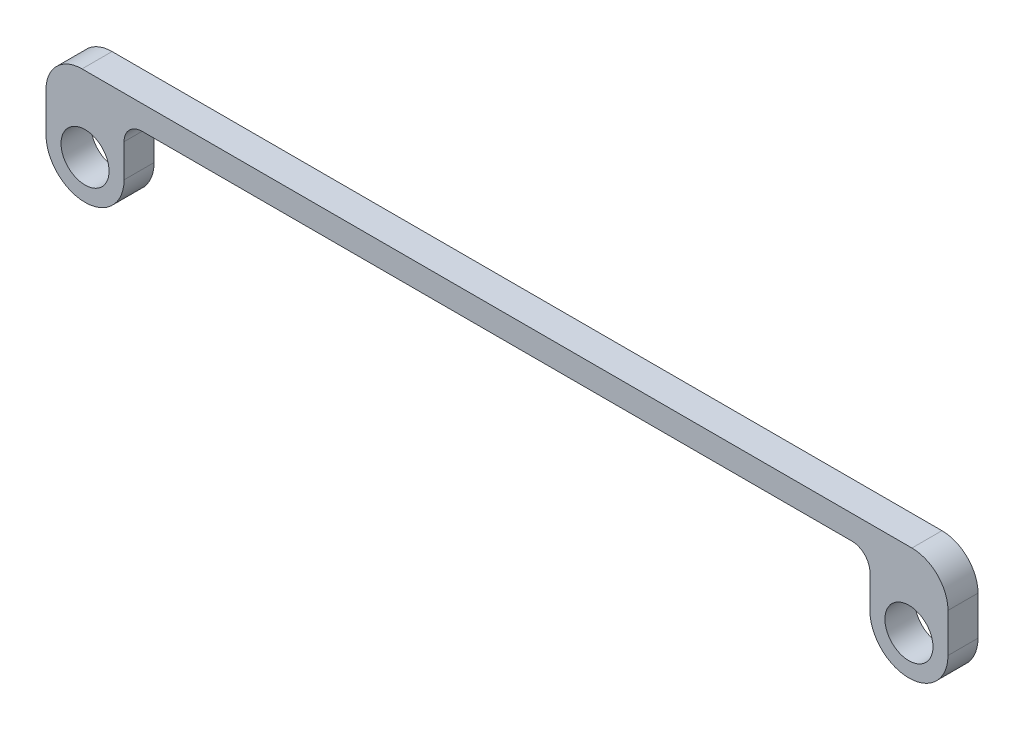
ISO-10303-21;
HEADER;
FILE_DESCRIPTION(('STEP AP214'),'2;1');
FILE_NAME('part.step','',(''),(''),'','','');
FILE_SCHEMA(('AUTOMOTIVE_DESIGN { 1 0 10303 214 1 1 1 1 }'));
ENDSEC;
DATA;
#1=APPLICATION_CONTEXT('core data for automotive mechanical design processes');
#2=APPLICATION_PROTOCOL_DEFINITION('international standard','automotive_design',2000,#1);
#3=PRODUCT_CONTEXT('',#1,'mechanical');
#4=PRODUCT('Part','Part','',(#3));
#5=PRODUCT_RELATED_PRODUCT_CATEGORY('part','',(#4));
#6=PRODUCT_DEFINITION_FORMATION('','',#4);
#7=PRODUCT_DEFINITION_CONTEXT('part definition',#1,'design');
#8=PRODUCT_DEFINITION('design','',#6,#7);
#9=PRODUCT_DEFINITION_SHAPE('','',#8);
#10=(LENGTH_UNIT() NAMED_UNIT(*) SI_UNIT(.MILLI.,.METRE.));
#11=(NAMED_UNIT(*) PLANE_ANGLE_UNIT() SI_UNIT($,.RADIAN.));
#12=(NAMED_UNIT(*) SI_UNIT($,.STERADIAN.) SOLID_ANGLE_UNIT());
#13=UNCERTAINTY_MEASURE_WITH_UNIT(LENGTH_MEASURE(1.E-05),#10,'distance_accuracy_value','');
#14=(GEOMETRIC_REPRESENTATION_CONTEXT(3) GLOBAL_UNCERTAINTY_ASSIGNED_CONTEXT((#13)) GLOBAL_UNIT_ASSIGNED_CONTEXT((#10,
#11,#12)) REPRESENTATION_CONTEXT('',''));
#15=CARTESIAN_POINT('',(0.,0.,0.));
#16=DIRECTION('',(0.,0.,1.));
#17=DIRECTION('',(1.,0.,0.));
#18=AXIS2_PLACEMENT_3D('',#15,#16,#17);
#19=CARTESIAN_POINT('',(0.,-4.,5.));
#20=DIRECTION('',(1.,0.,0.));
#21=DIRECTION('',(0.,0.,-1.));
#22=AXIS2_PLACEMENT_3D('',#19,#20,#21);
#23=PLANE('',#22);
#24=DIRECTION('',(0.,-1.,0.));
#25=VECTOR('',#24,1.);
#26=CARTESIAN_POINT('',(0.,0.,5.));
#27=LINE('',#26,#25);
#28=CARTESIAN_POINT('',(0.,-6.,5.));
#29=VERTEX_POINT('',#28);
#30=CARTESIAN_POINT('',(0.,-12.5,5.));
#31=VERTEX_POINT('',#30);
#32=EDGE_CURVE('E132',#29,#31,#27,.T.);
#33=ORIENTED_EDGE('',*,*,#32,.F.);
#34=DIRECTION('',(0.,0.,-1.));
#35=VECTOR('',#34,1.);
#36=CARTESIAN_POINT('',(0.,-6.,5.));
#37=LINE('',#36,#35);
#38=CARTESIAN_POINT('',(0.,-6.,0.));
#39=VERTEX_POINT('',#38);
#40=EDGE_CURVE('E240',#29,#39,#37,.T.);
#41=ORIENTED_EDGE('',*,*,#40,.T.);
#42=DIRECTION('',(0.,-1.,0.));
#43=VECTOR('',#42,1.);
#44=CARTESIAN_POINT('',(0.,-4.,0.));
#45=LINE('',#44,#43);
#46=CARTESIAN_POINT('',(0.,-12.5,0.));
#47=VERTEX_POINT('',#46);
#48=EDGE_CURVE('E151',#39,#47,#45,.T.);
#49=ORIENTED_EDGE('',*,*,#48,.T.);
#50=DIRECTION('',(0.,0.,-1.));
#51=VECTOR('',#50,1.);
#52=CARTESIAN_POINT('',(0.,-12.5,5.));
#53=LINE('',#52,#51);
#54=EDGE_CURVE('E149',#31,#47,#53,.T.);
#55=ORIENTED_EDGE('',*,*,#54,.F.);
#56=EDGE_LOOP('',(#33,#41,#49,#55));
#57=FACE_BOUND('',#56,.T.);
#58=ADVANCED_FACE('F43',(#57),#23,.F.);
#59=CARTESIAN_POINT('',(6.5,-12.5,5.));
#60=DIRECTION('',(0.,0.,-1.));
#61=DIRECTION('',(-1.,0.,0.));
#62=AXIS2_PLACEMENT_3D('',#59,#60,#61);
#63=CYLINDRICAL_SURFACE('',#62,6.5);
#64=CARTESIAN_POINT('',(6.5,-12.5,0.));
#65=DIRECTION('',(0.,0.,1.));
#66=DIRECTION('',(1.,0.,0.));
#67=AXIS2_PLACEMENT_3D('',#64,#65,#66);
#68=CIRCLE('',#67,6.5);
#69=CARTESIAN_POINT('',(13.,-12.5,0.));
#70=VERTEX_POINT('',#69);
#71=EDGE_CURVE('E186',#47,#70,#68,.T.);
#72=ORIENTED_EDGE('',*,*,#71,.T.);
#73=DIRECTION('',(0.,0.,-1.));
#74=VECTOR('',#73,1.);
#75=CARTESIAN_POINT('',(13.,-12.5,5.));
#76=LINE('',#75,#74);
#77=CARTESIAN_POINT('',(13.,-12.5,5.));
#78=VERTEX_POINT('',#77);
#79=EDGE_CURVE('E156',#78,#70,#76,.T.);
#80=ORIENTED_EDGE('',*,*,#79,.F.);
#81=CARTESIAN_POINT('',(6.5,-12.5,5.));
#82=DIRECTION('',(0.,0.,1.));
#83=DIRECTION('',(1.,0.,0.));
#84=AXIS2_PLACEMENT_3D('',#81,#82,#83);
#85=CIRCLE('',#84,6.5);
#86=EDGE_CURVE('E137',#31,#78,#85,.T.);
#87=ORIENTED_EDGE('',*,*,#86,.F.);
#88=ORIENTED_EDGE('',*,*,#54,.T.);
#89=EDGE_LOOP('',(#72,#80,#87,#88));
#90=FACE_BOUND('',#89,.T.);
#91=ADVANCED_FACE('F158',(#90),#63,.T.);
#92=CARTESIAN_POINT('',(13.,-4.,5.));
#93=DIRECTION('',(-1.,0.,0.));
#94=DIRECTION('',(0.,-1.,0.));
#95=AXIS2_PLACEMENT_3D('',#92,#93,#94);
#96=PLANE('',#95);
#97=DIRECTION('',(0.,1.,0.));
#98=VECTOR('',#97,1.);
#99=CARTESIAN_POINT('',(13.,-4.,0.));
#100=LINE('',#99,#98);
#101=CARTESIAN_POINT('',(13.,-7.,0.));
#102=VERTEX_POINT('',#101);
#103=EDGE_CURVE('E190',#70,#102,#100,.T.);
#104=ORIENTED_EDGE('',*,*,#103,.T.);
#105=DIRECTION('',(0.,0.,-1.));
#106=VECTOR('',#105,1.);
#107=CARTESIAN_POINT('',(13.,-7.,5.));
#108=LINE('',#107,#106);
#109=CARTESIAN_POINT('',(13.,-7.,5.));
#110=VERTEX_POINT('',#109);
#111=EDGE_CURVE('E59',#102,#110,#108,.F.);
#112=ORIENTED_EDGE('',*,*,#111,.T.);
#113=DIRECTION('',(0.,1.,0.));
#114=VECTOR('',#113,1.);
#115=CARTESIAN_POINT('',(13.,-4.,5.));
#116=LINE('',#115,#114);
#117=EDGE_CURVE('E161',#78,#110,#116,.T.);
#118=ORIENTED_EDGE('',*,*,#117,.F.);
#119=ORIENTED_EDGE('',*,*,#79,.T.);
#120=EDGE_LOOP('',(#104,#112,#118,#119));
#121=FACE_BOUND('',#120,.T.);
#122=ADVANCED_FACE('F282',(#121),#96,.F.);
#123=CARTESIAN_POINT('',(13.,-4.,5.));
#124=DIRECTION('',(0.,1.,0.));
#125=DIRECTION('',(0.,0.,1.));
#126=AXIS2_PLACEMENT_3D('',#123,#124,#125);
#127=PLANE('',#126);
#128=DIRECTION('',(1.,0.,0.));
#129=VECTOR('',#128,1.);
#130=CARTESIAN_POINT('',(13.,-4.,0.));
#131=LINE('',#130,#129);
#132=CARTESIAN_POINT('',(16.,-4.,0.));
#133=VERTEX_POINT('',#132);
#134=CARTESIAN_POINT('',(134.17,-4.,0.));
#135=VERTEX_POINT('',#134);
#136=EDGE_CURVE('E193',#133,#135,#131,.T.);
#137=ORIENTED_EDGE('',*,*,#136,.T.);
#138=DIRECTION('',(0.,0.,-1.));
#139=VECTOR('',#138,1.);
#140=CARTESIAN_POINT('',(134.17,-4.,5.));
#141=LINE('',#140,#139);
#142=CARTESIAN_POINT('',(134.17,-4.,5.));
#143=VERTEX_POINT('',#142);
#144=EDGE_CURVE('E251',#135,#143,#141,.F.);
#145=ORIENTED_EDGE('',*,*,#144,.T.);
#146=DIRECTION('',(1.,0.,0.));
#147=VECTOR('',#146,1.);
#148=CARTESIAN_POINT('',(13.,-4.,5.));
#149=LINE('',#148,#147);
#150=CARTESIAN_POINT('',(16.,-4.,5.));
#151=VERTEX_POINT('',#150);
#152=EDGE_CURVE('E164',#151,#143,#149,.T.);
#153=ORIENTED_EDGE('',*,*,#152,.F.);
#154=DIRECTION('',(0.,0.,-1.));
#155=VECTOR('',#154,1.);
#156=CARTESIAN_POINT('',(16.,-4.,0.));
#157=LINE('',#156,#155);
#158=EDGE_CURVE('E247',#151,#133,#157,.T.);
#159=ORIENTED_EDGE('',*,*,#158,.T.);
#160=EDGE_LOOP('',(#137,#145,#153,#159));
#161=FACE_BOUND('',#160,.T.);
#162=ADVANCED_FACE('F278',(#161),#127,.F.);
#163=CARTESIAN_POINT('',(137.17,-4.,5.));
#164=DIRECTION('',(1.,0.,0.));
#165=DIRECTION('',(0.,0.,-1.));
#166=AXIS2_PLACEMENT_3D('',#163,#164,#165);
#167=PLANE('',#166);
#168=DIRECTION('',(0.,-1.,0.));
#169=VECTOR('',#168,1.);
#170=CARTESIAN_POINT('',(137.17,-4.,5.));
#171=LINE('',#170,#169);
#172=CARTESIAN_POINT('',(137.17,-7.,5.));
#173=VERTEX_POINT('',#172);
#174=CARTESIAN_POINT('',(137.17,-12.5,5.));
#175=VERTEX_POINT('',#174);
#176=EDGE_CURVE('E171',#173,#175,#171,.T.);
#177=ORIENTED_EDGE('',*,*,#176,.F.);
#178=DIRECTION('',(0.,0.,-1.));
#179=VECTOR('',#178,1.);
#180=CARTESIAN_POINT('',(137.17,-7.,0.));
#181=LINE('',#180,#179);
#182=CARTESIAN_POINT('',(137.17,-7.,0.));
#183=VERTEX_POINT('',#182);
#184=EDGE_CURVE('E243',#173,#183,#181,.T.);
#185=ORIENTED_EDGE('',*,*,#184,.T.);
#186=DIRECTION('',(0.,-1.,0.));
#187=VECTOR('',#186,1.);
#188=CARTESIAN_POINT('',(137.17,-4.,0.));
#189=LINE('',#188,#187);
#190=CARTESIAN_POINT('',(137.17,-12.5,0.));
#191=VERTEX_POINT('',#190);
#192=EDGE_CURVE('E197',#183,#191,#189,.T.);
#193=ORIENTED_EDGE('',*,*,#192,.T.);
#194=DIRECTION('',(0.,0.,-1.));
#195=VECTOR('',#194,1.);
#196=CARTESIAN_POINT('',(137.17,-12.5,5.));
#197=LINE('',#196,#195);
#198=EDGE_CURVE('E214',#175,#191,#197,.T.);
#199=ORIENTED_EDGE('',*,*,#198,.F.);
#200=EDGE_LOOP('',(#177,#185,#193,#199));
#201=FACE_BOUND('',#200,.T.);
#202=ADVANCED_FACE('F270',(#201),#167,.F.);
#203=CARTESIAN_POINT('',(143.67,-12.5,5.));
#204=DIRECTION('',(0.,0.,-1.));
#205=DIRECTION('',(-1.,0.,0.));
#206=AXIS2_PLACEMENT_3D('',#203,#204,#205);
#207=CYLINDRICAL_SURFACE('',#206,6.50000000000001);
#208=CARTESIAN_POINT('',(143.67,-12.5,0.));
#209=DIRECTION('',(0.,0.,1.));
#210=DIRECTION('',(1.,0.,0.));
#211=AXIS2_PLACEMENT_3D('',#208,#209,#210);
#212=CIRCLE('',#211,6.50000000000001);
#213=CARTESIAN_POINT('',(150.17,-12.5,0.));
#214=VERTEX_POINT('',#213);
#215=EDGE_CURVE('E200',#191,#214,#212,.T.);
#216=ORIENTED_EDGE('',*,*,#215,.T.);
#217=DIRECTION('',(0.,0.,-1.));
#218=VECTOR('',#217,1.);
#219=CARTESIAN_POINT('',(150.17,-12.5,5.));
#220=LINE('',#219,#218);
#221=CARTESIAN_POINT('',(150.17,-12.5,5.));
#222=VERTEX_POINT('',#221);
#223=EDGE_CURVE('E183',#222,#214,#220,.T.);
#224=ORIENTED_EDGE('',*,*,#223,.F.);
#225=CARTESIAN_POINT('',(143.67,-12.5,5.));
#226=DIRECTION('',(0.,0.,1.));
#227=DIRECTION('',(1.,0.,0.));
#228=AXIS2_PLACEMENT_3D('',#225,#226,#227);
#229=CIRCLE('',#228,6.50000000000001);
#230=EDGE_CURVE('E174',#175,#222,#229,.T.);
#231=ORIENTED_EDGE('',*,*,#230,.F.);
#232=ORIENTED_EDGE('',*,*,#198,.T.);
#233=EDGE_LOOP('',(#216,#224,#231,#232));
#234=FACE_BOUND('',#233,.T.);
#235=ADVANCED_FACE('F313',(#234),#207,.T.);
#236=CARTESIAN_POINT('',(150.17,0.,5.));
#237=DIRECTION('',(-1.,0.,0.));
#238=DIRECTION('',(0.,0.,1.));
#239=AXIS2_PLACEMENT_3D('',#236,#237,#238);
#240=PLANE('',#239);
#241=DIRECTION('',(0.,1.,0.));
#242=VECTOR('',#241,1.);
#243=CARTESIAN_POINT('',(150.17,0.,0.));
#244=LINE('',#243,#242);
#245=CARTESIAN_POINT('',(150.17,-6.,0.));
#246=VERTEX_POINT('',#245);
#247=EDGE_CURVE('E204',#214,#246,#244,.T.);
#248=ORIENTED_EDGE('',*,*,#247,.T.);
#249=DIRECTION('',(0.,0.,-1.));
#250=VECTOR('',#249,1.);
#251=CARTESIAN_POINT('',(150.17,-6.,5.));
#252=LINE('',#251,#250);
#253=CARTESIAN_POINT('',(150.17,-6.,5.));
#254=VERTEX_POINT('',#253);
#255=EDGE_CURVE('E232',#246,#254,#252,.F.);
#256=ORIENTED_EDGE('',*,*,#255,.T.);
#257=DIRECTION('',(0.,1.,0.));
#258=VECTOR('',#257,1.);
#259=CARTESIAN_POINT('',(150.17,-4.,5.));
#260=LINE('',#259,#258);
#261=EDGE_CURVE('E177',#222,#254,#260,.T.);
#262=ORIENTED_EDGE('',*,*,#261,.F.);
#263=ORIENTED_EDGE('',*,*,#223,.T.);
#264=EDGE_LOOP('',(#248,#256,#262,#263));
#265=FACE_BOUND('',#264,.T.);
#266=ADVANCED_FACE('F316',(#265),#240,.F.);
#267=CARTESIAN_POINT('',(0.,0.,5.));
#268=DIRECTION('',(0.,-1.,0.));
#269=DIRECTION('',(0.,0.,-1.));
#270=AXIS2_PLACEMENT_3D('',#267,#268,#269);
#271=PLANE('',#270);
#272=DIRECTION('',(-1.,0.,0.));
#273=VECTOR('',#272,1.);
#274=CARTESIAN_POINT('',(130.17,0.,5.));
#275=LINE('',#274,#273);
#276=CARTESIAN_POINT('',(144.17,0.,5.));
#277=VERTEX_POINT('',#276);
#278=CARTESIAN_POINT('',(6.00000000000001,0.,5.));
#279=VERTEX_POINT('',#278);
#280=EDGE_CURVE('E180',#277,#279,#275,.T.);
#281=ORIENTED_EDGE('',*,*,#280,.F.);
#282=DIRECTION('',(0.,0.,-1.));
#283=VECTOR('',#282,1.);
#284=CARTESIAN_POINT('',(144.17,0.,5.));
#285=LINE('',#284,#283);
#286=CARTESIAN_POINT('',(144.17,0.,0.));
#287=VERTEX_POINT('',#286);
#288=EDGE_CURVE('E222',#277,#287,#285,.T.);
#289=ORIENTED_EDGE('',*,*,#288,.T.);
#290=DIRECTION('',(-1.,0.,0.));
#291=VECTOR('',#290,1.);
#292=CARTESIAN_POINT('',(0.,0.,0.));
#293=LINE('',#292,#291);
#294=CARTESIAN_POINT('',(6.,0.,0.));
#295=VERTEX_POINT('',#294);
#296=EDGE_CURVE('E146',#287,#295,#293,.T.);
#297=ORIENTED_EDGE('',*,*,#296,.T.);
#298=DIRECTION('',(0.,0.,-1.));
#299=VECTOR('',#298,1.);
#300=CARTESIAN_POINT('',(6.,0.,5.));
#301=LINE('',#300,#299);
#302=EDGE_CURVE('E155',#295,#279,#301,.F.);
#303=ORIENTED_EDGE('',*,*,#302,.T.);
#304=EDGE_LOOP('',(#281,#289,#297,#303));
#305=FACE_BOUND('',#304,.T.);
#306=ADVANCED_FACE('F287',(#305),#271,.F.);
#307=CARTESIAN_POINT('',(6.5,-12.5,5.));
#308=DIRECTION('',(0.,0.,1.));
#309=DIRECTION('',(1.,0.,0.));
#310=AXIS2_PLACEMENT_3D('',#307,#308,#309);
#311=PLANE('',#310);
#312=CARTESIAN_POINT('',(6.5,-12.5,5.));
#313=DIRECTION('',(0.,0.,1.));
#314=DIRECTION('',(1.,0.,0.));
#315=AXIS2_PLACEMENT_3D('',#312,#313,#314);
#316=CIRCLE('',#315,4.);
#317=CARTESIAN_POINT('',(10.5,-12.5,5.));
#318=VERTEX_POINT('',#317);
#319=EDGE_CURVE('E342',#318,#318,#316,.T.);
#320=ORIENTED_EDGE('',*,*,#319,.F.);
#321=EDGE_LOOP('',(#320));
#322=FACE_BOUND('',#321,.T.);
#323=CARTESIAN_POINT('',(143.67,-12.5,5.));
#324=DIRECTION('',(0.,0.,1.));
#325=DIRECTION('',(1.,0.,0.));
#326=AXIS2_PLACEMENT_3D('',#323,#324,#325);
#327=CIRCLE('',#326,3.99999999999999);
#328=CARTESIAN_POINT('',(147.67,-12.5,5.));
#329=VERTEX_POINT('',#328);
#330=EDGE_CURVE('E344',#329,#329,#327,.T.);
#331=ORIENTED_EDGE('',*,*,#330,.F.);
#332=EDGE_LOOP('',(#331));
#333=FACE_BOUND('',#332,.T.);
#334=ORIENTED_EDGE('',*,*,#261,.T.);
#335=CARTESIAN_POINT('',(144.17,-6.,5.));
#336=DIRECTION('',(0.,0.,1.));
#337=DIRECTION('',(1.,0.,0.));
#338=AXIS2_PLACEMENT_3D('',#335,#336,#337);
#339=CIRCLE('',#338,6.);
#340=EDGE_CURVE('E237',#254,#277,#339,.T.);
#341=ORIENTED_EDGE('',*,*,#340,.T.);
#342=ORIENTED_EDGE('',*,*,#280,.T.);
#343=CARTESIAN_POINT('',(6.,-6.,5.));
#344=DIRECTION('',(0.,0.,1.));
#345=DIRECTION('',(1.,0.,0.));
#346=AXIS2_PLACEMENT_3D('',#343,#344,#345);
#347=CIRCLE('',#346,6.);
#348=EDGE_CURVE('E141',#279,#29,#347,.T.);
#349=ORIENTED_EDGE('',*,*,#348,.T.);
#350=ORIENTED_EDGE('',*,*,#32,.T.);
#351=ORIENTED_EDGE('',*,*,#86,.T.);
#352=ORIENTED_EDGE('',*,*,#117,.T.);
#353=CARTESIAN_POINT('',(16.,-7.,5.));
#354=DIRECTION('',(0.,0.,1.));
#355=DIRECTION('',(1.,0.,0.));
#356=AXIS2_PLACEMENT_3D('',#353,#354,#355);
#357=CIRCLE('',#356,3.);
#358=EDGE_CURVE('E11',#110,#151,#357,.F.);
#359=ORIENTED_EDGE('',*,*,#358,.T.);
#360=ORIENTED_EDGE('',*,*,#152,.T.);
#361=CARTESIAN_POINT('',(134.17,-7.,5.));
#362=DIRECTION('',(0.,0.,1.));
#363=DIRECTION('',(1.,0.,0.));
#364=AXIS2_PLACEMENT_3D('',#361,#362,#363);
#365=CIRCLE('',#364,3.);
#366=EDGE_CURVE('E259',#143,#173,#365,.F.);
#367=ORIENTED_EDGE('',*,*,#366,.T.);
#368=ORIENTED_EDGE('',*,*,#176,.T.);
#369=ORIENTED_EDGE('',*,*,#230,.T.);
#370=EDGE_LOOP('',(#334,#341,#342,#349,#350,#351,#352,#359,#360,#367,#368,#369));
#371=FACE_BOUND('',#370,.T.);
#372=ADVANCED_FACE('F135',(#322,#333,#371),#311,.T.);
#373=CARTESIAN_POINT('',(6.5,-12.5,0.));
#374=DIRECTION('',(0.,0.,1.));
#375=DIRECTION('',(1.,0.,0.));
#376=AXIS2_PLACEMENT_3D('',#373,#374,#375);
#377=PLANE('',#376);
#378=CARTESIAN_POINT('',(6.5,-12.5,0.));
#379=DIRECTION('',(0.,0.,1.));
#380=DIRECTION('',(1.,0.,0.));
#381=AXIS2_PLACEMENT_3D('',#378,#379,#380);
#382=CIRCLE('',#381,4.);
#383=CARTESIAN_POINT('',(10.5,-12.5,0.));
#384=VERTEX_POINT('',#383);
#385=EDGE_CURVE('E187',#384,#384,#382,.T.);
#386=ORIENTED_EDGE('',*,*,#385,.T.);
#387=EDGE_LOOP('',(#386));
#388=FACE_BOUND('',#387,.T.);
#389=CARTESIAN_POINT('',(143.67,-12.5,0.));
#390=DIRECTION('',(0.,0.,1.));
#391=DIRECTION('',(1.,0.,0.));
#392=AXIS2_PLACEMENT_3D('',#389,#390,#391);
#393=CIRCLE('',#392,3.99999999999999);
#394=CARTESIAN_POINT('',(147.67,-12.5,0.));
#395=VERTEX_POINT('',#394);
#396=EDGE_CURVE('E350',#395,#395,#393,.T.);
#397=ORIENTED_EDGE('',*,*,#396,.T.);
#398=EDGE_LOOP('',(#397));
#399=FACE_BOUND('',#398,.T.);
#400=ORIENTED_EDGE('',*,*,#296,.F.);
#401=CARTESIAN_POINT('',(144.17,-6.,0.));
#402=DIRECTION('',(0.,0.,1.));
#403=DIRECTION('',(1.,0.,0.));
#404=AXIS2_PLACEMENT_3D('',#401,#402,#403);
#405=CIRCLE('',#404,6.);
#406=EDGE_CURVE('E229',#287,#246,#405,.F.);
#407=ORIENTED_EDGE('',*,*,#406,.T.);
#408=ORIENTED_EDGE('',*,*,#247,.F.);
#409=ORIENTED_EDGE('',*,*,#215,.F.);
#410=ORIENTED_EDGE('',*,*,#192,.F.);
#411=CARTESIAN_POINT('',(134.17,-7.,0.));
#412=DIRECTION('',(0.,0.,1.));
#413=DIRECTION('',(1.,0.,0.));
#414=AXIS2_PLACEMENT_3D('',#411,#412,#413);
#415=CIRCLE('',#414,3.);
#416=EDGE_CURVE('E256',#183,#135,#415,.T.);
#417=ORIENTED_EDGE('',*,*,#416,.T.);
#418=ORIENTED_EDGE('',*,*,#136,.F.);
#419=CARTESIAN_POINT('',(16.,-7.,0.));
#420=DIRECTION('',(0.,0.,1.));
#421=DIRECTION('',(1.,0.,0.));
#422=AXIS2_PLACEMENT_3D('',#419,#420,#421);
#423=CIRCLE('',#422,3.);
#424=EDGE_CURVE('E52',#133,#102,#423,.T.);
#425=ORIENTED_EDGE('',*,*,#424,.T.);
#426=ORIENTED_EDGE('',*,*,#103,.F.);
#427=ORIENTED_EDGE('',*,*,#71,.F.);
#428=ORIENTED_EDGE('',*,*,#48,.F.);
#429=CARTESIAN_POINT('',(6.,-6.,0.));
#430=DIRECTION('',(0.,0.,1.));
#431=DIRECTION('',(1.,0.,0.));
#432=AXIS2_PLACEMENT_3D('',#429,#430,#431);
#433=CIRCLE('',#432,6.);
#434=EDGE_CURVE('E226',#39,#295,#433,.F.);
#435=ORIENTED_EDGE('',*,*,#434,.T.);
#436=EDGE_LOOP('',(#400,#407,#408,#409,#410,#417,#418,#425,#426,#427,#428,#435));
#437=FACE_BOUND('',#436,.T.);
#438=ADVANCED_FACE('F275',(#388,#399,#437),#377,.F.);
#439=CARTESIAN_POINT('',(143.67,-12.5,0.));
#440=DIRECTION('',(0.,0.,1.));
#441=DIRECTION('',(1.,0.,0.));
#442=AXIS2_PLACEMENT_3D('',#439,#440,#441);
#443=CYLINDRICAL_SURFACE('',#442,3.99999999999999);
#444=ORIENTED_EDGE('',*,*,#396,.F.);
#445=EDGE_LOOP('',(#444));
#446=FACE_BOUND('',#445,.T.);
#447=ORIENTED_EDGE('',*,*,#330,.T.);
#448=EDGE_LOOP('',(#447));
#449=FACE_BOUND('',#448,.T.);
#450=ADVANCED_FACE('F325',(#446,#449),#443,.F.);
#451=CARTESIAN_POINT('',(6.5,-12.5,0.));
#452=DIRECTION('',(0.,0.,1.));
#453=DIRECTION('',(1.,0.,0.));
#454=AXIS2_PLACEMENT_3D('',#451,#452,#453);
#455=CYLINDRICAL_SURFACE('',#454,4.);
#456=ORIENTED_EDGE('',*,*,#385,.F.);
#457=EDGE_LOOP('',(#456));
#458=FACE_BOUND('',#457,.T.);
#459=ORIENTED_EDGE('',*,*,#319,.T.);
#460=EDGE_LOOP('',(#459));
#461=FACE_BOUND('',#460,.T.);
#462=ADVANCED_FACE('F297',(#458,#461),#455,.F.);
#463=CARTESIAN_POINT('',(144.17,-6.,5.));
#464=DIRECTION('',(0.,0.,-1.));
#465=DIRECTION('',(-1.,0.,0.));
#466=AXIS2_PLACEMENT_3D('',#463,#464,#465);
#467=CYLINDRICAL_SURFACE('',#466,6.);
#468=ORIENTED_EDGE('',*,*,#340,.F.);
#469=ORIENTED_EDGE('',*,*,#255,.F.);
#470=ORIENTED_EDGE('',*,*,#406,.F.);
#471=ORIENTED_EDGE('',*,*,#288,.F.);
#472=EDGE_LOOP('',(#468,#469,#470,#471));
#473=FACE_BOUND('',#472,.T.);
#474=ADVANCED_FACE('F291',(#473),#467,.T.);
#475=CARTESIAN_POINT('',(6.,-6.,5.));
#476=DIRECTION('',(0.,0.,-1.));
#477=DIRECTION('',(-1.,0.,0.));
#478=AXIS2_PLACEMENT_3D('',#475,#476,#477);
#479=CYLINDRICAL_SURFACE('',#478,6.);
#480=ORIENTED_EDGE('',*,*,#348,.F.);
#481=ORIENTED_EDGE('',*,*,#302,.F.);
#482=ORIENTED_EDGE('',*,*,#434,.F.);
#483=ORIENTED_EDGE('',*,*,#40,.F.);
#484=EDGE_LOOP('',(#480,#481,#482,#483));
#485=FACE_BOUND('',#484,.T.);
#486=ADVANCED_FACE('F289',(#485),#479,.T.);
#487=CARTESIAN_POINT('',(134.17,-7.,5.));
#488=DIRECTION('',(0.,0.,1.));
#489=DIRECTION('',(1.,0.,0.));
#490=AXIS2_PLACEMENT_3D('',#487,#488,#489);
#491=CYLINDRICAL_SURFACE('',#490,3.);
#492=ORIENTED_EDGE('',*,*,#366,.F.);
#493=ORIENTED_EDGE('',*,*,#144,.F.);
#494=ORIENTED_EDGE('',*,*,#416,.F.);
#495=ORIENTED_EDGE('',*,*,#184,.F.);
#496=EDGE_LOOP('',(#492,#493,#494,#495));
#497=FACE_BOUND('',#496,.T.);
#498=ADVANCED_FACE('F273',(#497),#491,.F.);
#499=CARTESIAN_POINT('',(16.,-7.,5.));
#500=DIRECTION('',(0.,0.,1.));
#501=DIRECTION('',(1.,0.,0.));
#502=AXIS2_PLACEMENT_3D('',#499,#500,#501);
#503=CYLINDRICAL_SURFACE('',#502,3.);
#504=ORIENTED_EDGE('',*,*,#358,.F.);
#505=ORIENTED_EDGE('',*,*,#111,.F.);
#506=ORIENTED_EDGE('',*,*,#424,.F.);
#507=ORIENTED_EDGE('',*,*,#158,.F.);
#508=EDGE_LOOP('',(#504,#505,#506,#507));
#509=FACE_BOUND('',#508,.T.);
#510=ADVANCED_FACE('F45',(#509),#503,.F.);
#511=CLOSED_SHELL('',(#58,#91,#122,#162,#202,#235,#266,#306,#372,#438,#450,#462,#474,#486,#498,#510));
#512=MANIFOLD_SOLID_BREP('B2',#511);
#513=ADVANCED_BREP_SHAPE_REPRESENTATION('',(#18,#512),#14);
#514=SHAPE_DEFINITION_REPRESENTATION(#9,#513);
ENDSEC;
END-ISO-10303-21;
